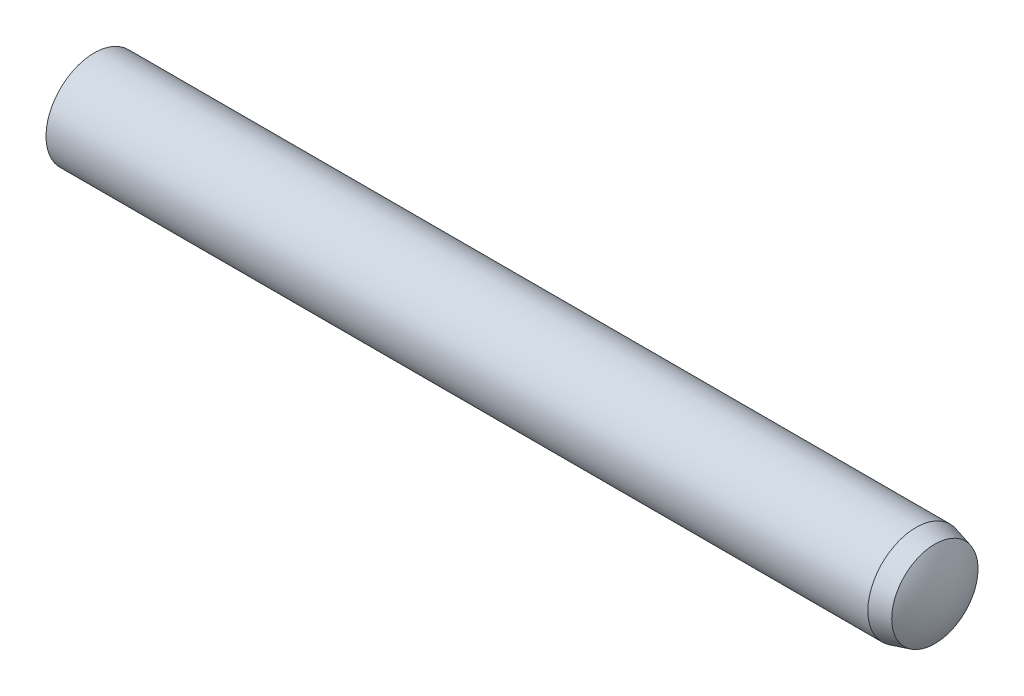
ISO-10303-21;
HEADER;
FILE_DESCRIPTION(('STEP AP214'),'2;1');
FILE_NAME('part.step','',(''),(''),'','','');
FILE_SCHEMA(('AUTOMOTIVE_DESIGN { 1 0 10303 214 1 1 1 1 }'));
ENDSEC;
DATA;
#1=APPLICATION_CONTEXT('core data for automotive mechanical design processes');
#2=APPLICATION_PROTOCOL_DEFINITION('international standard','automotive_design',2000,#1);
#3=PRODUCT_CONTEXT('',#1,'mechanical');
#4=PRODUCT('Part','Part','',(#3));
#5=PRODUCT_RELATED_PRODUCT_CATEGORY('part','',(#4));
#6=PRODUCT_DEFINITION_FORMATION('','',#4);
#7=PRODUCT_DEFINITION_CONTEXT('part definition',#1,'design');
#8=PRODUCT_DEFINITION('design','',#6,#7);
#9=PRODUCT_DEFINITION_SHAPE('','',#8);
#10=(LENGTH_UNIT() NAMED_UNIT(*) SI_UNIT(.MILLI.,.METRE.));
#11=(NAMED_UNIT(*) PLANE_ANGLE_UNIT() SI_UNIT($,.RADIAN.));
#12=(NAMED_UNIT(*) SI_UNIT($,.STERADIAN.) SOLID_ANGLE_UNIT());
#13=UNCERTAINTY_MEASURE_WITH_UNIT(LENGTH_MEASURE(1.E-05),#10,'distance_accuracy_value','');
#14=(GEOMETRIC_REPRESENTATION_CONTEXT(3) GLOBAL_UNCERTAINTY_ASSIGNED_CONTEXT((#13)) GLOBAL_UNIT_ASSIGNED_CONTEXT((#10,
#11,#12)) REPRESENTATION_CONTEXT('',''));
#15=CARTESIAN_POINT('',(0.,0.,0.));
#16=DIRECTION('',(0.,0.,1.));
#17=DIRECTION('',(1.,0.,0.));
#18=AXIS2_PLACEMENT_3D('',#15,#16,#17);
#19=CARTESIAN_POINT('',(-9.,0.,0.));
#20=DIRECTION('',(1.,0.,0.));
#21=DIRECTION('',(0.,0.,-1.));
#22=AXIS2_PLACEMENT_3D('',#19,#20,#21);
#23=CYLINDRICAL_SURFACE('',#22,0.999999999999999);
#24=CARTESIAN_POINT('',(8.35,0.,0.));
#25=DIRECTION('',(-1.,0.,0.));
#26=DIRECTION('',(0.,0.,1.));
#27=AXIS2_PLACEMENT_3D('',#24,#25,#26);
#28=CIRCLE('',#27,0.999999999999994);
#29=CARTESIAN_POINT('',(8.35,0.,0.999999999999994));
#30=VERTEX_POINT('',#29);
#31=EDGE_CURVE('E11',#30,#30,#28,.T.);
#32=ORIENTED_EDGE('',*,*,#31,.T.);
#33=EDGE_LOOP('',(#32));
#34=FACE_BOUND('',#33,.T.);
#35=CARTESIAN_POINT('',(-8.7,0.,0.));
#36=DIRECTION('',(-1.,0.,0.));
#37=DIRECTION('',(0.,0.,1.));
#38=AXIS2_PLACEMENT_3D('',#35,#36,#37);
#39=CIRCLE('',#38,0.999999999999999);
#40=CARTESIAN_POINT('',(-8.7,0.,0.999999999999999));
#41=VERTEX_POINT('',#40);
#42=EDGE_CURVE('E54',#41,#41,#39,.T.);
#43=ORIENTED_EDGE('',*,*,#42,.F.);
#44=EDGE_LOOP('',(#43));
#45=FACE_BOUND('',#44,.T.);
#46=ADVANCED_FACE('F34',(#34,#45),#23,.T.);
#47=CARTESIAN_POINT('',(8.35,0.,0.));
#48=DIRECTION('',(-1.,0.,0.));
#49=DIRECTION('',(0.,0.,1.));
#50=AXIS2_PLACEMENT_3D('',#47,#48,#49);
#51=CONICAL_SURFACE('',#50,0.999999999999994,0.261799387799149);
#52=CARTESIAN_POINT('',(8.74,0.,0.));
#53=DIRECTION('',(-1.,0.,0.));
#54=DIRECTION('',(0.,0.,1.));
#55=AXIS2_PLACEMENT_3D('',#52,#53,#54);
#56=CIRCLE('',#55,0.895499814951857);
#57=CARTESIAN_POINT('',(8.74,0.,0.895499814951857));
#58=VERTEX_POINT('',#57);
#59=EDGE_CURVE('E41',#58,#58,#56,.T.);
#60=ORIENTED_EDGE('',*,*,#59,.T.);
#61=EDGE_LOOP('',(#60));
#62=FACE_BOUND('',#61,.T.);
#63=ORIENTED_EDGE('',*,*,#31,.F.);
#64=EDGE_LOOP('',(#63));
#65=FACE_BOUND('',#64,.T.);
#66=ADVANCED_FACE('F60',(#62,#65),#51,.T.);
#67=CARTESIAN_POINT('',(7.32784631042536,0.,0.));
#68=DIRECTION('',(-1.,0.,0.));
#69=DIRECTION('',(0.,1.,0.));
#70=AXIS2_PLACEMENT_3D('',#67,#68,#69);
#71=SPHERICAL_SURFACE('',#70,1.67215368957464);
#72=CARTESIAN_POINT('',(9.,0.,0.));
#73=VERTEX_POINT('',#72);
#74=VERTEX_LOOP('',#73);
#75=FACE_BOUND('',#74,.T.);
#76=ORIENTED_EDGE('',*,*,#59,.F.);
#77=EDGE_LOOP('',(#76));
#78=FACE_BOUND('',#77,.T.);
#79=ADVANCED_FACE('F50',(#75,#78),#71,.T.);
#80=CARTESIAN_POINT('',(-7.18333333333335,0.,0.));
#81=DIRECTION('',(-1.,0.,0.));
#82=DIRECTION('',(0.,-1.,0.));
#83=AXIS2_PLACEMENT_3D('',#80,#81,#82);
#84=SPHERICAL_SURFACE('',#83,1.81666666666666);
#85=CARTESIAN_POINT('',(-9.,0.,0.));
#86=VERTEX_POINT('',#85);
#87=VERTEX_LOOP('',#86);
#88=FACE_BOUND('',#87,.T.);
#89=ORIENTED_EDGE('',*,*,#42,.T.);
#90=EDGE_LOOP('',(#89));
#91=FACE_BOUND('',#90,.T.);
#92=ADVANCED_FACE('F47',(#88,#91),#84,.T.);
#93=CLOSED_SHELL('',(#46,#66,#79,#92));
#94=MANIFOLD_SOLID_BREP('B2',#93);
#95=ADVANCED_BREP_SHAPE_REPRESENTATION('',(#18,#94),#14);
#96=SHAPE_DEFINITION_REPRESENTATION(#9,#95);
ENDSEC;
END-ISO-10303-21;
